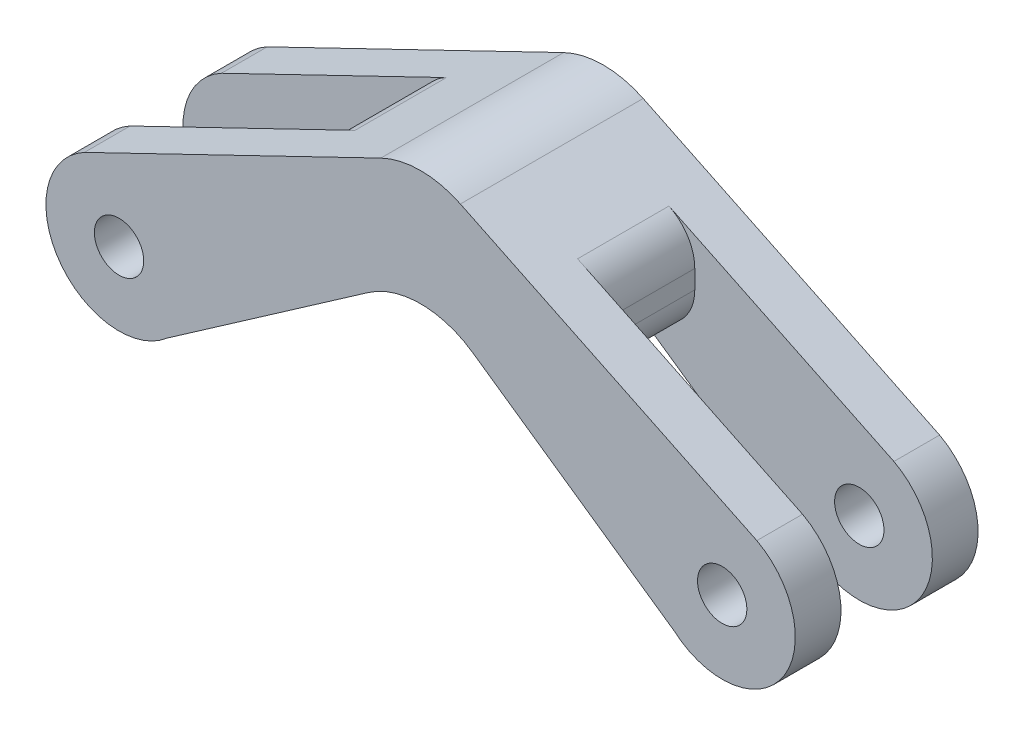
ISO-10303-21;
HEADER;
FILE_DESCRIPTION(('STEP AP214'),'2;1');
FILE_NAME('part.step','',(''),(''),'','','');
FILE_SCHEMA(('AUTOMOTIVE_DESIGN { 1 0 10303 214 1 1 1 1 }'));
ENDSEC;
DATA;
#1=APPLICATION_CONTEXT('core data for automotive mechanical design processes');
#2=APPLICATION_PROTOCOL_DEFINITION('international standard','automotive_design',2000,#1);
#3=PRODUCT_CONTEXT('',#1,'mechanical');
#4=PRODUCT('Part','Part','',(#3));
#5=PRODUCT_RELATED_PRODUCT_CATEGORY('part','',(#4));
#6=PRODUCT_DEFINITION_FORMATION('','',#4);
#7=PRODUCT_DEFINITION_CONTEXT('part definition',#1,'design');
#8=PRODUCT_DEFINITION('design','',#6,#7);
#9=PRODUCT_DEFINITION_SHAPE('','',#8);
#10=(LENGTH_UNIT() NAMED_UNIT(*) SI_UNIT(.MILLI.,.METRE.));
#11=(NAMED_UNIT(*) PLANE_ANGLE_UNIT() SI_UNIT($,.RADIAN.));
#12=(NAMED_UNIT(*) SI_UNIT($,.STERADIAN.) SOLID_ANGLE_UNIT());
#13=UNCERTAINTY_MEASURE_WITH_UNIT(LENGTH_MEASURE(1.E-05),#10,'distance_accuracy_value','');
#14=(GEOMETRIC_REPRESENTATION_CONTEXT(3) GLOBAL_UNCERTAINTY_ASSIGNED_CONTEXT((#13)) GLOBAL_UNIT_ASSIGNED_CONTEXT((#10,
#11,#12)) REPRESENTATION_CONTEXT('',''));
#15=CARTESIAN_POINT('',(0.,0.,0.));
#16=DIRECTION('',(0.,0.,1.));
#17=DIRECTION('',(1.,0.,0.));
#18=AXIS2_PLACEMENT_3D('',#15,#16,#17);
#19=CARTESIAN_POINT('',(0.,0.,0.));
#20=DIRECTION('',(0.,0.,1.));
#21=DIRECTION('',(1.,0.,0.));
#22=AXIS2_PLACEMENT_3D('',#19,#20,#21);
#23=PLANE('',#22);
#24=CARTESIAN_POINT('',(0.,0.,0.));
#25=DIRECTION('',(0.,0.,1.));
#26=DIRECTION('',(1.,0.,0.));
#27=AXIS2_PLACEMENT_3D('',#24,#25,#26);
#28=CIRCLE('',#27,1.7145);
#29=CARTESIAN_POINT('',(1.7145,0.,0.));
#30=VERTEX_POINT('',#29);
#31=EDGE_CURVE('E261',#30,#30,#28,.T.);
#32=ORIENTED_EDGE('',*,*,#31,.T.);
#33=EDGE_LOOP('',(#32));
#34=FACE_BOUND('',#33,.T.);
#35=DIRECTION('',(0.,1.,0.));
#36=VECTOR('',#35,1.);
#37=CARTESIAN_POINT('',(11.43,-21.59,0.));
#38=LINE('',#37,#36);
#39=CARTESIAN_POINT('',(11.43,7.88041539796579,0.));
#40=VERTEX_POINT('',#39);
#41=CARTESIAN_POINT('',(11.43,9.16917968452816,0.));
#42=VERTEX_POINT('',#41);
#43=EDGE_CURVE('E252',#40,#42,#38,.T.);
#44=ORIENTED_EDGE('',*,*,#43,.F.);
#45=CARTESIAN_POINT('',(14.605,7.88041539796579,0.));
#46=DIRECTION('',(0.,0.,1.));
#47=DIRECTION('',(1.,0.,0.));
#48=AXIS2_PLACEMENT_3D('',#45,#46,#47);
#49=CIRCLE('',#48,3.175);
#50=CARTESIAN_POINT('',(16.418933125613,5.27460043603855,0.));
#51=VERTEX_POINT('',#50);
#52=EDGE_CURVE('E43',#40,#51,#49,.T.);
#53=ORIENTED_EDGE('',*,*,#52,.T.);
#54=DIRECTION('',(-0.820729121866846,-0.571317519878111,0.));
#55=VECTOR('',#54,1.);
#56=CARTESIAN_POINT('',(2.88595672970742,-4.14583598455693,0.));
#57=LINE('',#56,#55);
#58=CARTESIAN_POINT('',(3.32770250004454,-3.83833245970139,0.));
#59=VERTEX_POINT('',#58);
#60=EDGE_CURVE('E50',#51,#59,#57,.T.);
#61=ORIENTED_EDGE('',*,*,#60,.T.);
#62=CARTESIAN_POINT('',(0.,0.,0.));
#63=DIRECTION('',(0.,0.,1.));
#64=DIRECTION('',(1.,0.,0.));
#65=AXIS2_PLACEMENT_3D('',#62,#63,#64);
#66=CIRCLE('',#65,5.08);
#67=CARTESIAN_POINT('',(-2.40732534983982,4.47338626322594,0.));
#68=VERTEX_POINT('',#67);
#69=EDGE_CURVE('E294',#68,#59,#66,.T.);
#70=ORIENTED_EDGE('',*,*,#69,.F.);
#71=DIRECTION('',(-0.900358431435915,-0.435149049111058,0.));
#72=VECTOR('',#71,1.);
#73=CARTESIAN_POINT('',(-2.20846687708953,4.56949584836856,0.));
#74=LINE('',#73,#72);
#75=CARTESIAN_POINT('',(13.2234017690724,12.0278177043372,0.));
#76=VERTEX_POINT('',#75);
#77=EDGE_CURVE('E292',#76,#68,#74,.T.);
#78=ORIENTED_EDGE('',*,*,#77,.F.);
#79=CARTESIAN_POINT('',(14.605,9.16917968452816,0.));
#80=DIRECTION('',(0.,0.,1.));
#81=DIRECTION('',(1.,0.,0.));
#82=AXIS2_PLACEMENT_3D('',#79,#80,#81);
#83=CIRCLE('',#82,3.175);
#84=EDGE_CURVE('E336',#76,#42,#83,.T.);
#85=ORIENTED_EDGE('',*,*,#84,.T.);
#86=EDGE_LOOP('',(#44,#53,#61,#70,#78,#85));
#87=FACE_BOUND('',#86,.T.);
#88=ADVANCED_FACE('F35',(#34,#87),#23,.F.);
#89=CARTESIAN_POINT('',(41.91,0.,3.175));
#90=DIRECTION('',(0.,0.,-1.));
#91=DIRECTION('',(-1.,0.,0.));
#92=AXIS2_PLACEMENT_3D('',#89,#90,#91);
#93=CYLINDRICAL_SURFACE('',#92,5.07999999999999);
#94=CARTESIAN_POINT('',(41.91,0.,0.));
#95=DIRECTION('',(0.,0.,1.));
#96=DIRECTION('',(1.,0.,0.));
#97=AXIS2_PLACEMENT_3D('',#94,#95,#96);
#98=CIRCLE('',#97,5.07999999999999);
#99=CARTESIAN_POINT('',(44.3173253498398,4.47338626322595,0.));
#100=VERTEX_POINT('',#99);
#101=CARTESIAN_POINT('',(38.5822974999555,-3.83833245970138,0.));
#102=VERTEX_POINT('',#101);
#103=EDGE_CURVE('E287',#100,#102,#98,.F.);
#104=ORIENTED_EDGE('',*,*,#103,.F.);
#105=DIRECTION('',(0.,0.,-1.));
#106=VECTOR('',#105,1.);
#107=CARTESIAN_POINT('',(44.3173253498398,4.47338626322595,3.175));
#108=LINE('',#107,#106);
#109=CARTESIAN_POINT('',(44.3173253498398,4.47338626322595,3.175));
#110=VERTEX_POINT('',#109);
#111=EDGE_CURVE('E253',#110,#100,#108,.T.);
#112=ORIENTED_EDGE('',*,*,#111,.F.);
#113=CARTESIAN_POINT('',(41.91,0.,3.175));
#114=DIRECTION('',(0.,0.,1.));
#115=DIRECTION('',(1.,0.,0.));
#116=AXIS2_PLACEMENT_3D('',#113,#114,#115);
#117=CIRCLE('',#116,5.07999999999999);
#118=CARTESIAN_POINT('',(38.5822974999555,-3.83833245970138,3.175));
#119=VERTEX_POINT('',#118);
#120=EDGE_CURVE('E260',#110,#119,#117,.F.);
#121=ORIENTED_EDGE('',*,*,#120,.T.);
#122=DIRECTION('',(0.,0.,-1.));
#123=VECTOR('',#122,1.);
#124=CARTESIAN_POINT('',(38.5822974999555,-3.83833245970138,3.175));
#125=LINE('',#124,#123);
#126=EDGE_CURVE('E284',#119,#102,#125,.T.);
#127=ORIENTED_EDGE('',*,*,#126,.T.);
#128=EDGE_LOOP('',(#104,#112,#121,#127));
#129=FACE_BOUND('',#128,.T.);
#130=ADVANCED_FACE('F414',(#129),#93,.T.);
#131=CARTESIAN_POINT('',(10.1443221421196,20.9894195805271,3.175));
#132=DIRECTION('',(0.435149049111058,0.900358431435915,0.));
#133=DIRECTION('',(-0.900358431435915,0.435149049111058,0.));
#134=AXIS2_PLACEMENT_3D('',#131,#132,#133);
#135=PLANE('',#134);
#136=DIRECTION('',(0.,0.,-1.));
#137=VECTOR('',#136,1.);
#138=CARTESIAN_POINT('',(28.6865982309276,12.0278177043372,3.17499999999999));
#139=LINE('',#138,#137);
#140=CARTESIAN_POINT('',(28.6865982309276,12.0278177043372,0.));
#141=VERTEX_POINT('',#140);
#142=CARTESIAN_POINT('',(28.6865982309276,12.0278177043372,-6.35));
#143=VERTEX_POINT('',#142);
#144=EDGE_CURVE('E178',#141,#143,#139,.T.);
#145=ORIENTED_EDGE('',*,*,#144,.T.);
#146=DIRECTION('',(0.900358431435915,-0.435149049111058,0.));
#147=VECTOR('',#146,1.);
#148=CARTESIAN_POINT('',(10.1443221421196,20.9894195805271,-6.35));
#149=LINE('',#148,#147);
#150=CARTESIAN_POINT('',(44.3173253498398,4.47338626322595,-6.35));
#151=VERTEX_POINT('',#150);
#152=EDGE_CURVE('E171',#143,#151,#149,.T.);
#153=ORIENTED_EDGE('',*,*,#152,.T.);
#154=DIRECTION('',(0.,0.,-1.));
#155=VECTOR('',#154,1.);
#156=CARTESIAN_POINT('',(44.3173253498398,4.47338626322595,-6.35));
#157=LINE('',#156,#155);
#158=CARTESIAN_POINT('',(44.3173253498398,4.47338626322595,-9.525));
#159=VERTEX_POINT('',#158);
#160=EDGE_CURVE('E175',#151,#159,#157,.T.);
#161=ORIENTED_EDGE('',*,*,#160,.T.);
#162=DIRECTION('',(0.900358431435915,-0.435149049111058,0.));
#163=VECTOR('',#162,1.);
#164=CARTESIAN_POINT('',(10.1443221421196,20.9894195805271,-9.525));
#165=LINE('',#164,#163);
#166=CARTESIAN_POINT('',(23.7181964618552,14.4290783911123,-9.525));
#167=VERTEX_POINT('',#166);
#168=EDGE_CURVE('E218',#167,#159,#165,.T.);
#169=ORIENTED_EDGE('',*,*,#168,.F.);
#170=DIRECTION('',(0.,0.,-1.));
#171=VECTOR('',#170,1.);
#172=CARTESIAN_POINT('',(23.7181964618552,14.4290783911123,3.175));
#173=LINE('',#172,#171);
#174=CARTESIAN_POINT('',(23.7181964618552,14.4290783911123,3.175));
#175=VERTEX_POINT('',#174);
#176=EDGE_CURVE('E315',#175,#167,#173,.T.);
#177=ORIENTED_EDGE('',*,*,#176,.F.);
#178=DIRECTION('',(0.900358431435915,-0.435149049111058,0.));
#179=VECTOR('',#178,1.);
#180=CARTESIAN_POINT('',(10.1443221421196,20.9894195805271,3.175));
#181=LINE('',#180,#179);
#182=EDGE_CURVE('E264',#175,#110,#181,.T.);
#183=ORIENTED_EDGE('',*,*,#182,.T.);
#184=ORIENTED_EDGE('',*,*,#111,.T.);
#185=DIRECTION('',(0.900358431435915,-0.435149049111058,0.));
#186=VECTOR('',#185,1.);
#187=CARTESIAN_POINT('',(10.1443221421196,20.9894195805271,0.));
#188=LINE('',#187,#186);
#189=EDGE_CURVE('E290',#141,#100,#188,.T.);
#190=ORIENTED_EDGE('',*,*,#189,.F.);
#191=EDGE_LOOP('',(#145,#153,#161,#169,#177,#183,#184,#190));
#192=FACE_BOUND('',#191,.T.);
#193=ADVANCED_FACE('F173',(#192),#135,.T.);
#194=CARTESIAN_POINT('',(20.955,8.71180235149422,3.175));
#195=DIRECTION('',(0.,0.,-1.));
#196=DIRECTION('',(-1.,0.,0.));
#197=AXIS2_PLACEMENT_3D('',#194,#195,#196);
#198=CYLINDRICAL_SURFACE('',#197,6.35);
#199=ORIENTED_EDGE('',*,*,#176,.T.);
#200=CARTESIAN_POINT('',(20.955,8.71180235149422,-9.525));
#201=DIRECTION('',(0.,0.,1.));
#202=DIRECTION('',(1.,0.,0.));
#203=AXIS2_PLACEMENT_3D('',#200,#201,#202);
#204=CIRCLE('',#203,6.35);
#205=CARTESIAN_POINT('',(18.1918035381448,14.4290783911123,-9.525));
#206=VERTEX_POINT('',#205);
#207=EDGE_CURVE('E220',#206,#167,#204,.F.);
#208=ORIENTED_EDGE('',*,*,#207,.F.);
#209=DIRECTION('',(0.,0.,-1.));
#210=VECTOR('',#209,1.);
#211=CARTESIAN_POINT('',(18.1918035381448,14.4290783911123,3.175));
#212=LINE('',#211,#210);
#213=CARTESIAN_POINT('',(18.1918035381448,14.4290783911123,3.175));
#214=VERTEX_POINT('',#213);
#215=EDGE_CURVE('E313',#214,#206,#212,.T.);
#216=ORIENTED_EDGE('',*,*,#215,.F.);
#217=CARTESIAN_POINT('',(20.955,8.71180235149422,3.175));
#218=DIRECTION('',(0.,0.,1.));
#219=DIRECTION('',(1.,0.,0.));
#220=AXIS2_PLACEMENT_3D('',#217,#218,#219);
#221=CIRCLE('',#220,6.35);
#222=EDGE_CURVE('E266',#214,#175,#221,.F.);
#223=ORIENTED_EDGE('',*,*,#222,.T.);
#224=EDGE_LOOP('',(#199,#208,#216,#223));
#225=FACE_BOUND('',#224,.T.);
#226=ADVANCED_FACE('F441',(#225),#198,.T.);
#227=CARTESIAN_POINT('',(-2.20846687708953,4.56949584836856,3.175));
#228=DIRECTION('',(0.435149049111058,-0.900358431435915,0.));
#229=DIRECTION('',(0.900358431435915,0.435149049111058,0.));
#230=AXIS2_PLACEMENT_3D('',#227,#228,#229);
#231=PLANE('',#230);
#232=DIRECTION('',(0.,0.,1.));
#233=VECTOR('',#232,1.);
#234=CARTESIAN_POINT('',(13.2234017690724,12.0278177043372,0.));
#235=LINE('',#234,#233);
#236=CARTESIAN_POINT('',(13.2234017690724,12.0278177043372,-6.35));
#237=VERTEX_POINT('',#236);
#238=EDGE_CURVE('E256',#237,#76,#235,.T.);
#239=ORIENTED_EDGE('',*,*,#238,.T.);
#240=ORIENTED_EDGE('',*,*,#77,.T.);
#241=DIRECTION('',(0.,0.,-1.));
#242=VECTOR('',#241,1.);
#243=CARTESIAN_POINT('',(-2.40732534983982,4.47338626322594,3.175));
#244=LINE('',#243,#242);
#245=CARTESIAN_POINT('',(-2.40732534983982,4.47338626322594,3.175));
#246=VERTEX_POINT('',#245);
#247=EDGE_CURVE('E310',#246,#68,#244,.T.);
#248=ORIENTED_EDGE('',*,*,#247,.F.);
#249=DIRECTION('',(-0.900358431435915,-0.435149049111058,0.));
#250=VECTOR('',#249,1.);
#251=CARTESIAN_POINT('',(-2.20846687708953,4.56949584836856,3.175));
#252=LINE('',#251,#250);
#253=EDGE_CURVE('E269',#214,#246,#252,.T.);
#254=ORIENTED_EDGE('',*,*,#253,.F.);
#255=ORIENTED_EDGE('',*,*,#215,.T.);
#256=DIRECTION('',(-0.900358431435915,-0.435149049111058,0.));
#257=VECTOR('',#256,1.);
#258=CARTESIAN_POINT('',(-2.20846687708953,4.56949584836856,-9.525));
#259=LINE('',#258,#257);
#260=CARTESIAN_POINT('',(-2.40732534983982,4.47338626322594,-9.525));
#261=VERTEX_POINT('',#260);
#262=EDGE_CURVE('E223',#206,#261,#259,.T.);
#263=ORIENTED_EDGE('',*,*,#262,.T.);
#264=DIRECTION('',(0.,0.,-1.));
#265=VECTOR('',#264,1.);
#266=CARTESIAN_POINT('',(-2.40732534983982,4.47338626322594,-6.35));
#267=LINE('',#266,#265);
#268=CARTESIAN_POINT('',(-2.40732534983982,4.47338626322594,-6.35));
#269=VERTEX_POINT('',#268);
#270=EDGE_CURVE('E192',#269,#261,#267,.T.);
#271=ORIENTED_EDGE('',*,*,#270,.F.);
#272=DIRECTION('',(-0.900358431435915,-0.435149049111058,0.));
#273=VECTOR('',#272,1.);
#274=CARTESIAN_POINT('',(-2.20846687708953,4.56949584836856,-6.35));
#275=LINE('',#274,#273);
#276=EDGE_CURVE('E182',#237,#269,#275,.T.);
#277=ORIENTED_EDGE('',*,*,#276,.F.);
#278=EDGE_LOOP('',(#239,#240,#248,#254,#255,#263,#271,#277));
#279=FACE_BOUND('',#278,.T.);
#280=ADVANCED_FACE('F396',(#279),#231,.F.);
#281=CARTESIAN_POINT('',(0.,0.,3.175));
#282=DIRECTION('',(0.,0.,-1.));
#283=DIRECTION('',(-1.,0.,0.));
#284=AXIS2_PLACEMENT_3D('',#281,#282,#283);
#285=CYLINDRICAL_SURFACE('',#284,5.08);
#286=ORIENTED_EDGE('',*,*,#69,.T.);
#287=DIRECTION('',(0.,0.,-1.));
#288=VECTOR('',#287,1.);
#289=CARTESIAN_POINT('',(3.32770250004454,-3.83833245970139,3.175));
#290=LINE('',#289,#288);
#291=CARTESIAN_POINT('',(3.32770250004454,-3.83833245970139,3.175));
#292=VERTEX_POINT('',#291);
#293=EDGE_CURVE('E308',#292,#59,#290,.T.);
#294=ORIENTED_EDGE('',*,*,#293,.F.);
#295=CARTESIAN_POINT('',(0.,0.,3.175));
#296=DIRECTION('',(0.,0.,1.));
#297=DIRECTION('',(1.,0.,0.));
#298=AXIS2_PLACEMENT_3D('',#295,#296,#297);
#299=CIRCLE('',#298,5.08);
#300=EDGE_CURVE('E271',#246,#292,#299,.T.);
#301=ORIENTED_EDGE('',*,*,#300,.F.);
#302=ORIENTED_EDGE('',*,*,#247,.T.);
#303=EDGE_LOOP('',(#286,#294,#301,#302));
#304=FACE_BOUND('',#303,.T.);
#305=ADVANCED_FACE('F388',(#304),#285,.T.);
#306=CARTESIAN_POINT('',(2.88595672970742,-4.14583598455693,3.175));
#307=DIRECTION('',(0.571317519878111,-0.820729121866846,0.));
#308=DIRECTION('',(0.820729121866846,0.571317519878111,0.));
#309=AXIS2_PLACEMENT_3D('',#306,#307,#308);
#310=PLANE('',#309);
#311=ORIENTED_EDGE('',*,*,#60,.F.);
#312=DIRECTION('',(0.,0.,1.));
#313=VECTOR('',#312,1.);
#314=CARTESIAN_POINT('',(16.418933125613,5.27460043603856,3.175));
#315=LINE('',#314,#313);
#316=CARTESIAN_POINT('',(16.418933125613,5.27460043603856,-6.35));
#317=VERTEX_POINT('',#316);
#318=EDGE_CURVE('E334',#51,#317,#315,.F.);
#319=ORIENTED_EDGE('',*,*,#318,.T.);
#320=DIRECTION('',(-0.820729121866846,-0.571317519878111,0.));
#321=VECTOR('',#320,1.);
#322=CARTESIAN_POINT('',(2.88595672970742,-4.14583598455693,-6.35));
#323=LINE('',#322,#321);
#324=CARTESIAN_POINT('',(3.32770250004454,-3.83833245970139,-6.35));
#325=VERTEX_POINT('',#324);
#326=EDGE_CURVE('E57',#317,#325,#323,.T.);
#327=ORIENTED_EDGE('',*,*,#326,.T.);
#328=DIRECTION('',(0.,0.,-1.));
#329=VECTOR('',#328,1.);
#330=CARTESIAN_POINT('',(3.32770250004454,-3.83833245970139,-6.35));
#331=LINE('',#330,#329);
#332=CARTESIAN_POINT('',(3.32770250004454,-3.83833245970139,-9.525));
#333=VERTEX_POINT('',#332);
#334=EDGE_CURVE('E238',#325,#333,#331,.T.);
#335=ORIENTED_EDGE('',*,*,#334,.T.);
#336=DIRECTION('',(-0.820729121866846,-0.571317519878111,0.));
#337=VECTOR('',#336,1.);
#338=CARTESIAN_POINT('',(2.88595672970742,-4.14583598455693,-9.525));
#339=LINE('',#338,#337);
#340=CARTESIAN_POINT('',(17.327133748774,5.90680771826079,-9.525));
#341=VERTEX_POINT('',#340);
#342=EDGE_CURVE('E228',#341,#333,#339,.T.);
#343=ORIENTED_EDGE('',*,*,#342,.F.);
#344=DIRECTION('',(0.,0.,-1.));
#345=VECTOR('',#344,1.);
#346=CARTESIAN_POINT('',(17.327133748774,5.90680771826079,3.175));
#347=LINE('',#346,#345);
#348=CARTESIAN_POINT('',(17.327133748774,5.90680771826079,3.175));
#349=VERTEX_POINT('',#348);
#350=EDGE_CURVE('E306',#349,#341,#347,.T.);
#351=ORIENTED_EDGE('',*,*,#350,.F.);
#352=DIRECTION('',(-0.820729121866846,-0.571317519878111,0.));
#353=VECTOR('',#352,1.);
#354=CARTESIAN_POINT('',(2.88595672970742,-4.14583598455693,3.175));
#355=LINE('',#354,#353);
#356=EDGE_CURVE('E274',#349,#292,#355,.T.);
#357=ORIENTED_EDGE('',*,*,#356,.T.);
#358=ORIENTED_EDGE('',*,*,#293,.T.);
#359=EDGE_LOOP('',(#311,#319,#327,#335,#343,#351,#357,#358));
#360=FACE_BOUND('',#359,.T.);
#361=ADVANCED_FACE('F356',(#360),#310,.T.);
#362=CARTESIAN_POINT('',(20.955,0.695177794406331,3.175));
#363=DIRECTION('',(0.,0.,-1.));
#364=DIRECTION('',(-1.,0.,0.));
#365=AXIS2_PLACEMENT_3D('',#362,#363,#364);
#366=CYLINDRICAL_SURFACE('',#365,6.35);
#367=ORIENTED_EDGE('',*,*,#350,.T.);
#368=CARTESIAN_POINT('',(20.955,0.695177794406331,-9.525));
#369=DIRECTION('',(0.,0.,1.));
#370=DIRECTION('',(1.,0.,0.));
#371=AXIS2_PLACEMENT_3D('',#368,#369,#370);
#372=CIRCLE('',#371,6.35);
#373=CARTESIAN_POINT('',(24.582866251226,5.90680771826079,-9.525));
#374=VERTEX_POINT('',#373);
#375=EDGE_CURVE('E230',#341,#374,#372,.F.);
#376=ORIENTED_EDGE('',*,*,#375,.T.);
#377=DIRECTION('',(0.,0.,-1.));
#378=VECTOR('',#377,1.);
#379=CARTESIAN_POINT('',(24.582866251226,5.90680771826079,3.175));
#380=LINE('',#379,#378);
#381=CARTESIAN_POINT('',(24.582866251226,5.90680771826079,3.175));
#382=VERTEX_POINT('',#381);
#383=EDGE_CURVE('E304',#382,#374,#380,.T.);
#384=ORIENTED_EDGE('',*,*,#383,.F.);
#385=CARTESIAN_POINT('',(20.955,0.695177794406331,3.175));
#386=DIRECTION('',(0.,0.,1.));
#387=DIRECTION('',(1.,0.,0.));
#388=AXIS2_PLACEMENT_3D('',#385,#386,#387);
#389=CIRCLE('',#388,6.35);
#390=EDGE_CURVE('E276',#349,#382,#389,.F.);
#391=ORIENTED_EDGE('',*,*,#390,.F.);
#392=EDGE_LOOP('',(#367,#376,#384,#391));
#393=FACE_BOUND('',#392,.T.);
#394=ADVANCED_FACE('F377',(#393),#366,.F.);
#395=CARTESIAN_POINT('',(10.7936226943522,15.505634200729,3.175));
#396=DIRECTION('',(0.57131751987811,0.820729121866847,0.));
#397=DIRECTION('',(-0.820729121866847,0.57131751987811,0.));
#398=AXIS2_PLACEMENT_3D('',#395,#396,#397);
#399=PLANE('',#398);
#400=DIRECTION('',(0.,0.,1.));
#401=VECTOR('',#400,1.);
#402=CARTESIAN_POINT('',(25.491066874387,5.27460043603855,0.));
#403=LINE('',#402,#401);
#404=CARTESIAN_POINT('',(25.491066874387,5.27460043603855,-6.35));
#405=VERTEX_POINT('',#404);
#406=CARTESIAN_POINT('',(25.491066874387,5.27460043603855,0.));
#407=VERTEX_POINT('',#406);
#408=EDGE_CURVE('E331',#405,#407,#403,.T.);
#409=ORIENTED_EDGE('',*,*,#408,.T.);
#410=DIRECTION('',(0.820729121866847,-0.57131751987811,0.));
#411=VECTOR('',#410,1.);
#412=CARTESIAN_POINT('',(10.7936226943522,15.505634200729,0.));
#413=LINE('',#412,#411);
#414=EDGE_CURVE('E298',#407,#102,#413,.T.);
#415=ORIENTED_EDGE('',*,*,#414,.T.);
#416=ORIENTED_EDGE('',*,*,#126,.F.);
#417=DIRECTION('',(0.820729121866847,-0.57131751987811,0.));
#418=VECTOR('',#417,1.);
#419=CARTESIAN_POINT('',(10.7936226943522,15.505634200729,3.175));
#420=LINE('',#419,#418);
#421=EDGE_CURVE('E279',#382,#119,#420,.T.);
#422=ORIENTED_EDGE('',*,*,#421,.F.);
#423=ORIENTED_EDGE('',*,*,#383,.T.);
#424=DIRECTION('',(0.820729121866847,-0.57131751987811,0.));
#425=VECTOR('',#424,1.);
#426=CARTESIAN_POINT('',(10.7936226943522,15.505634200729,-9.525));
#427=LINE('',#426,#425);
#428=CARTESIAN_POINT('',(38.5822974999555,-3.83833245970138,-9.525));
#429=VERTEX_POINT('',#428);
#430=EDGE_CURVE('E233',#374,#429,#427,.T.);
#431=ORIENTED_EDGE('',*,*,#430,.T.);
#432=DIRECTION('',(0.,0.,-1.));
#433=VECTOR('',#432,1.);
#434=CARTESIAN_POINT('',(38.5822974999555,-3.83833245970138,-6.35));
#435=LINE('',#434,#433);
#436=CARTESIAN_POINT('',(38.5822974999555,-3.83833245970138,-6.35));
#437=VERTEX_POINT('',#436);
#438=EDGE_CURVE('E213',#437,#429,#435,.T.);
#439=ORIENTED_EDGE('',*,*,#438,.F.);
#440=DIRECTION('',(0.820729121866847,-0.57131751987811,0.));
#441=VECTOR('',#440,1.);
#442=CARTESIAN_POINT('',(10.7936226943522,15.505634200729,-6.35));
#443=LINE('',#442,#441);
#444=EDGE_CURVE('E197',#405,#437,#443,.T.);
#445=ORIENTED_EDGE('',*,*,#444,.F.);
#446=EDGE_LOOP('',(#409,#415,#416,#422,#423,#431,#439,#445));
#447=FACE_BOUND('',#446,.T.);
#448=ADVANCED_FACE('F429',(#447),#399,.F.);
#449=CARTESIAN_POINT('',(41.91,0.,3.175));
#450=DIRECTION('',(0.,0.,-1.));
#451=DIRECTION('',(-1.,0.,0.));
#452=AXIS2_PLACEMENT_3D('',#449,#450,#451);
#453=CYLINDRICAL_SURFACE('',#452,1.7145);
#454=CARTESIAN_POINT('',(41.91,0.,3.175));
#455=DIRECTION('',(0.,0.,1.));
#456=DIRECTION('',(1.,0.,0.));
#457=AXIS2_PLACEMENT_3D('',#454,#455,#456);
#458=CIRCLE('',#457,1.7145);
#459=CARTESIAN_POINT('',(43.6245,0.,3.175));
#460=VERTEX_POINT('',#459);
#461=EDGE_CURVE('E257',#460,#460,#458,.T.);
#462=ORIENTED_EDGE('',*,*,#461,.T.);
#463=EDGE_LOOP('',(#462));
#464=FACE_BOUND('',#463,.T.);
#465=CARTESIAN_POINT('',(41.91,0.,0.));
#466=DIRECTION('',(0.,0.,1.));
#467=DIRECTION('',(1.,0.,0.));
#468=AXIS2_PLACEMENT_3D('',#465,#466,#467);
#469=CIRCLE('',#468,1.7145);
#470=CARTESIAN_POINT('',(43.6245,0.,0.));
#471=VERTEX_POINT('',#470);
#472=EDGE_CURVE('E246',#471,#471,#469,.T.);
#473=ORIENTED_EDGE('',*,*,#472,.F.);
#474=EDGE_LOOP('',(#473));
#475=FACE_BOUND('',#474,.T.);
#476=ADVANCED_FACE('F427',(#464,#475),#453,.F.);
#477=CARTESIAN_POINT('',(0.,0.,3.175));
#478=DIRECTION('',(0.,0.,-1.));
#479=DIRECTION('',(-1.,0.,0.));
#480=AXIS2_PLACEMENT_3D('',#477,#478,#479);
#481=CYLINDRICAL_SURFACE('',#480,1.7145);
#482=CARTESIAN_POINT('',(0.,0.,3.175));
#483=DIRECTION('',(0.,0.,1.));
#484=DIRECTION('',(1.,0.,0.));
#485=AXIS2_PLACEMENT_3D('',#482,#483,#484);
#486=CIRCLE('',#485,1.7145);
#487=CARTESIAN_POINT('',(1.7145,0.,3.175));
#488=VERTEX_POINT('',#487);
#489=EDGE_CURVE('E281',#488,#488,#486,.T.);
#490=ORIENTED_EDGE('',*,*,#489,.T.);
#491=EDGE_LOOP('',(#490));
#492=FACE_BOUND('',#491,.T.);
#493=ORIENTED_EDGE('',*,*,#31,.F.);
#494=EDGE_LOOP('',(#493));
#495=FACE_BOUND('',#494,.T.);
#496=ADVANCED_FACE('F424',(#492,#495),#481,.F.);
#497=CARTESIAN_POINT('',(0.,0.,3.175));
#498=DIRECTION('',(0.,0.,1.));
#499=DIRECTION('',(1.,0.,0.));
#500=AXIS2_PLACEMENT_3D('',#497,#498,#499);
#501=PLANE('',#500);
#502=ORIENTED_EDGE('',*,*,#461,.F.);
#503=EDGE_LOOP('',(#502));
#504=FACE_BOUND('',#503,.T.);
#505=ORIENTED_EDGE('',*,*,#120,.F.);
#506=ORIENTED_EDGE('',*,*,#182,.F.);
#507=ORIENTED_EDGE('',*,*,#222,.F.);
#508=ORIENTED_EDGE('',*,*,#253,.T.);
#509=ORIENTED_EDGE('',*,*,#300,.T.);
#510=ORIENTED_EDGE('',*,*,#356,.F.);
#511=ORIENTED_EDGE('',*,*,#390,.T.);
#512=ORIENTED_EDGE('',*,*,#421,.T.);
#513=EDGE_LOOP('',(#505,#506,#507,#508,#509,#510,#511,#512));
#514=FACE_BOUND('',#513,.T.);
#515=ORIENTED_EDGE('',*,*,#489,.F.);
#516=EDGE_LOOP('',(#515));
#517=FACE_BOUND('',#516,.T.);
#518=ADVANCED_FACE('F380',(#504,#514,#517),#501,.T.);
#519=ORIENTED_EDGE('',*,*,#472,.T.);
#520=EDGE_LOOP('',(#519));
#521=FACE_BOUND('',#520,.T.);
#522=ORIENTED_EDGE('',*,*,#414,.F.);
#523=CARTESIAN_POINT('',(27.305,7.88041539796579,0.));
#524=DIRECTION('',(0.,0.,1.));
#525=DIRECTION('',(1.,0.,0.));
#526=AXIS2_PLACEMENT_3D('',#523,#524,#525);
#527=CIRCLE('',#526,3.175);
#528=CARTESIAN_POINT('',(30.48,7.88041539796579,0.));
#529=VERTEX_POINT('',#528);
#530=EDGE_CURVE('E346',#407,#529,#527,.T.);
#531=ORIENTED_EDGE('',*,*,#530,.T.);
#532=DIRECTION('',(0.,1.,0.));
#533=VECTOR('',#532,1.);
#534=CARTESIAN_POINT('',(30.48,-21.59,0.));
#535=LINE('',#534,#533);
#536=CARTESIAN_POINT('',(30.48,9.16917968452816,0.));
#537=VERTEX_POINT('',#536);
#538=EDGE_CURVE('E249',#529,#537,#535,.T.);
#539=ORIENTED_EDGE('',*,*,#538,.T.);
#540=CARTESIAN_POINT('',(27.305,9.16917968452816,0.));
#541=DIRECTION('',(0.,0.,1.));
#542=DIRECTION('',(1.,0.,0.));
#543=AXIS2_PLACEMENT_3D('',#540,#541,#542);
#544=CIRCLE('',#543,3.175);
#545=EDGE_CURVE('E343',#537,#141,#544,.T.);
#546=ORIENTED_EDGE('',*,*,#545,.T.);
#547=ORIENTED_EDGE('',*,*,#189,.T.);
#548=ORIENTED_EDGE('',*,*,#103,.T.);
#549=EDGE_LOOP('',(#522,#531,#539,#546,#547,#548));
#550=FACE_BOUND('',#549,.T.);
#551=ADVANCED_FACE('F402',(#521,#550),#23,.F.);
#552=CARTESIAN_POINT('',(11.43,-21.59,0.));
#553=DIRECTION('',(-1.,0.,0.));
#554=DIRECTION('',(0.,0.,1.));
#555=AXIS2_PLACEMENT_3D('',#552,#553,#554);
#556=PLANE('',#555);
#557=ORIENTED_EDGE('',*,*,#43,.T.);
#558=DIRECTION('',(0.,0.,1.));
#559=VECTOR('',#558,1.);
#560=CARTESIAN_POINT('',(11.43,9.16917968452816,-6.35));
#561=LINE('',#560,#559);
#562=CARTESIAN_POINT('',(11.43,9.16917968452816,-6.35));
#563=VERTEX_POINT('',#562);
#564=EDGE_CURVE('E324',#42,#563,#561,.F.);
#565=ORIENTED_EDGE('',*,*,#564,.T.);
#566=DIRECTION('',(0.,1.,0.));
#567=VECTOR('',#566,1.);
#568=CARTESIAN_POINT('',(11.43,-21.59,-6.35));
#569=LINE('',#568,#567);
#570=CARTESIAN_POINT('',(11.43,7.88041539796579,-6.35));
#571=VERTEX_POINT('',#570);
#572=EDGE_CURVE('E243',#571,#563,#569,.T.);
#573=ORIENTED_EDGE('',*,*,#572,.F.);
#574=DIRECTION('',(0.,0.,1.));
#575=VECTOR('',#574,1.);
#576=CARTESIAN_POINT('',(11.43,7.88041539796579,0.));
#577=LINE('',#576,#575);
#578=EDGE_CURVE('E321',#571,#40,#577,.T.);
#579=ORIENTED_EDGE('',*,*,#578,.T.);
#580=EDGE_LOOP('',(#557,#565,#573,#579));
#581=FACE_BOUND('',#580,.T.);
#582=ADVANCED_FACE('F399',(#581),#556,.T.);
#583=CARTESIAN_POINT('',(30.48,-21.59,0.));
#584=DIRECTION('',(1.,0.,0.));
#585=DIRECTION('',(0.,0.,-1.));
#586=AXIS2_PLACEMENT_3D('',#583,#584,#585);
#587=PLANE('',#586);
#588=DIRECTION('',(0.,1.,0.));
#589=VECTOR('',#588,1.);
#590=CARTESIAN_POINT('',(30.48,-21.59,-6.35));
#591=LINE('',#590,#589);
#592=CARTESIAN_POINT('',(30.48,7.88041539796579,-6.35));
#593=VERTEX_POINT('',#592);
#594=CARTESIAN_POINT('',(30.48,9.16917968452816,-6.35));
#595=VERTEX_POINT('',#594);
#596=EDGE_CURVE('E191',#593,#595,#591,.T.);
#597=ORIENTED_EDGE('',*,*,#596,.T.);
#598=DIRECTION('',(0.,0.,-1.));
#599=VECTOR('',#598,1.);
#600=CARTESIAN_POINT('',(30.48,9.16917968452816,0.));
#601=LINE('',#600,#599);
#602=EDGE_CURVE('E329',#595,#537,#601,.F.);
#603=ORIENTED_EDGE('',*,*,#602,.T.);
#604=ORIENTED_EDGE('',*,*,#538,.F.);
#605=DIRECTION('',(0.,0.,1.));
#606=VECTOR('',#605,1.);
#607=CARTESIAN_POINT('',(30.48,7.88041539796579,-6.35));
#608=LINE('',#607,#606);
#609=EDGE_CURVE('E327',#529,#593,#608,.F.);
#610=ORIENTED_EDGE('',*,*,#609,.T.);
#611=EDGE_LOOP('',(#597,#603,#604,#610));
#612=FACE_BOUND('',#611,.T.);
#613=ADVANCED_FACE('F401',(#612),#587,.T.);
#614=CARTESIAN_POINT('',(0.,0.,-6.35));
#615=DIRECTION('',(0.,0.,1.));
#616=DIRECTION('',(1.,0.,0.));
#617=AXIS2_PLACEMENT_3D('',#614,#615,#616);
#618=PLANE('',#617);
#619=CARTESIAN_POINT('',(41.91,0.,-6.35));
#620=DIRECTION('',(0.,0.,1.));
#621=DIRECTION('',(1.,0.,0.));
#622=AXIS2_PLACEMENT_3D('',#619,#620,#621);
#623=CIRCLE('',#622,1.7145);
#624=CARTESIAN_POINT('',(43.6245,0.,-6.35));
#625=VERTEX_POINT('',#624);
#626=EDGE_CURVE('E199',#625,#625,#623,.T.);
#627=ORIENTED_EDGE('',*,*,#626,.F.);
#628=EDGE_LOOP('',(#627));
#629=FACE_BOUND('',#628,.T.);
#630=ORIENTED_EDGE('',*,*,#596,.F.);
#631=CARTESIAN_POINT('',(27.305,7.88041539796579,-6.35));
#632=DIRECTION('',(0.,0.,1.));
#633=DIRECTION('',(1.,0.,0.));
#634=AXIS2_PLACEMENT_3D('',#631,#632,#633);
#635=CIRCLE('',#634,3.175);
#636=EDGE_CURVE('E348',#593,#405,#635,.F.);
#637=ORIENTED_EDGE('',*,*,#636,.T.);
#638=ORIENTED_EDGE('',*,*,#444,.T.);
#639=CARTESIAN_POINT('',(41.91,0.,-6.35));
#640=DIRECTION('',(0.,0.,1.));
#641=DIRECTION('',(1.,0.,0.));
#642=AXIS2_PLACEMENT_3D('',#639,#640,#641);
#643=CIRCLE('',#642,5.07999999999999);
#644=EDGE_CURVE('E183',#151,#437,#643,.F.);
#645=ORIENTED_EDGE('',*,*,#644,.F.);
#646=ORIENTED_EDGE('',*,*,#152,.F.);
#647=CARTESIAN_POINT('',(27.305,9.16917968452816,-6.35));
#648=DIRECTION('',(0.,0.,1.));
#649=DIRECTION('',(1.,0.,0.));
#650=AXIS2_PLACEMENT_3D('',#647,#648,#649);
#651=CIRCLE('',#650,3.175);
#652=EDGE_CURVE('E341',#143,#595,#651,.F.);
#653=ORIENTED_EDGE('',*,*,#652,.T.);
#654=EDGE_LOOP('',(#630,#637,#638,#645,#646,#653));
#655=FACE_BOUND('',#654,.T.);
#656=ADVANCED_FACE('F195',(#629,#655),#618,.T.);
#657=CARTESIAN_POINT('',(41.91,0.,-6.35));
#658=DIRECTION('',(0.,0.,-1.));
#659=DIRECTION('',(-1.,0.,0.));
#660=AXIS2_PLACEMENT_3D('',#657,#658,#659);
#661=CYLINDRICAL_SURFACE('',#660,5.07999999999999);
#662=CARTESIAN_POINT('',(41.91,0.,-9.525));
#663=DIRECTION('',(0.,0.,1.));
#664=DIRECTION('',(1.,0.,0.));
#665=AXIS2_PLACEMENT_3D('',#662,#663,#664);
#666=CIRCLE('',#665,5.07999999999999);
#667=EDGE_CURVE('E190',#159,#429,#666,.F.);
#668=ORIENTED_EDGE('',*,*,#667,.F.);
#669=ORIENTED_EDGE('',*,*,#160,.F.);
#670=ORIENTED_EDGE('',*,*,#644,.T.);
#671=ORIENTED_EDGE('',*,*,#438,.T.);
#672=EDGE_LOOP('',(#668,#669,#670,#671));
#673=FACE_BOUND('',#672,.T.);
#674=ADVANCED_FACE('F187',(#673),#661,.T.);
#675=CARTESIAN_POINT('',(0.,0.,-6.35));
#676=DIRECTION('',(0.,0.,-1.));
#677=DIRECTION('',(-1.,0.,0.));
#678=AXIS2_PLACEMENT_3D('',#675,#676,#677);
#679=CYLINDRICAL_SURFACE('',#678,5.08);
#680=CARTESIAN_POINT('',(0.,0.,-9.525));
#681=DIRECTION('',(0.,0.,1.));
#682=DIRECTION('',(1.,0.,0.));
#683=AXIS2_PLACEMENT_3D('',#680,#681,#682);
#684=CIRCLE('',#683,5.08);
#685=EDGE_CURVE('E225',#261,#333,#684,.T.);
#686=ORIENTED_EDGE('',*,*,#685,.T.);
#687=ORIENTED_EDGE('',*,*,#334,.F.);
#688=CARTESIAN_POINT('',(0.,0.,-6.35));
#689=DIRECTION('',(0.,0.,1.));
#690=DIRECTION('',(1.,0.,0.));
#691=AXIS2_PLACEMENT_3D('',#688,#689,#690);
#692=CIRCLE('',#691,5.08);
#693=EDGE_CURVE('E206',#269,#325,#692,.T.);
#694=ORIENTED_EDGE('',*,*,#693,.F.);
#695=ORIENTED_EDGE('',*,*,#270,.T.);
#696=EDGE_LOOP('',(#686,#687,#694,#695));
#697=FACE_BOUND('',#696,.T.);
#698=ADVANCED_FACE('F364',(#697),#679,.T.);
#699=CARTESIAN_POINT('',(41.91,0.,-6.35));
#700=DIRECTION('',(0.,0.,-1.));
#701=DIRECTION('',(-1.,0.,0.));
#702=AXIS2_PLACEMENT_3D('',#699,#700,#701);
#703=CYLINDRICAL_SURFACE('',#702,1.7145);
#704=ORIENTED_EDGE('',*,*,#626,.T.);
#705=EDGE_LOOP('',(#704));
#706=FACE_BOUND('',#705,.T.);
#707=CARTESIAN_POINT('',(41.91,0.,-9.525));
#708=DIRECTION('',(0.,0.,1.));
#709=DIRECTION('',(1.,0.,0.));
#710=AXIS2_PLACEMENT_3D('',#707,#708,#709);
#711=CIRCLE('',#710,1.7145);
#712=CARTESIAN_POINT('',(43.6245,0.,-9.525));
#713=VERTEX_POINT('',#712);
#714=EDGE_CURVE('E214',#713,#713,#711,.T.);
#715=ORIENTED_EDGE('',*,*,#714,.F.);
#716=EDGE_LOOP('',(#715));
#717=FACE_BOUND('',#716,.T.);
#718=ADVANCED_FACE('F678',(#706,#717),#703,.F.);
#719=CARTESIAN_POINT('',(0.,0.,-6.35));
#720=DIRECTION('',(0.,0.,-1.));
#721=DIRECTION('',(-1.,0.,0.));
#722=AXIS2_PLACEMENT_3D('',#719,#720,#721);
#723=CYLINDRICAL_SURFACE('',#722,1.7145);
#724=CARTESIAN_POINT('',(0.,0.,-6.35));
#725=DIRECTION('',(0.,0.,1.));
#726=DIRECTION('',(1.,0.,0.));
#727=AXIS2_PLACEMENT_3D('',#724,#725,#726);
#728=CIRCLE('',#727,1.7145);
#729=CARTESIAN_POINT('',(1.7145,0.,-6.35));
#730=VERTEX_POINT('',#729);
#731=EDGE_CURVE('E210',#730,#730,#728,.T.);
#732=ORIENTED_EDGE('',*,*,#731,.T.);
#733=EDGE_LOOP('',(#732));
#734=FACE_BOUND('',#733,.T.);
#735=CARTESIAN_POINT('',(0.,0.,-9.525));
#736=DIRECTION('',(0.,0.,1.));
#737=DIRECTION('',(1.,0.,0.));
#738=AXIS2_PLACEMENT_3D('',#735,#736,#737);
#739=CIRCLE('',#738,1.7145);
#740=CARTESIAN_POINT('',(1.7145,0.,-9.525));
#741=VERTEX_POINT('',#740);
#742=EDGE_CURVE('E202',#741,#741,#739,.T.);
#743=ORIENTED_EDGE('',*,*,#742,.F.);
#744=EDGE_LOOP('',(#743));
#745=FACE_BOUND('',#744,.T.);
#746=ADVANCED_FACE('F500',(#734,#745),#723,.F.);
#747=ORIENTED_EDGE('',*,*,#326,.F.);
#748=CARTESIAN_POINT('',(14.605,7.88041539796579,-6.35));
#749=DIRECTION('',(0.,0.,1.));
#750=DIRECTION('',(1.,0.,0.));
#751=AXIS2_PLACEMENT_3D('',#748,#749,#750);
#752=CIRCLE('',#751,3.175);
#753=EDGE_CURVE('E11',#317,#571,#752,.F.);
#754=ORIENTED_EDGE('',*,*,#753,.T.);
#755=ORIENTED_EDGE('',*,*,#572,.T.);
#756=CARTESIAN_POINT('',(14.605,9.16917968452816,-6.35));
#757=DIRECTION('',(0.,0.,1.));
#758=DIRECTION('',(1.,0.,0.));
#759=AXIS2_PLACEMENT_3D('',#756,#757,#758);
#760=CIRCLE('',#759,3.175);
#761=EDGE_CURVE('E338',#563,#237,#760,.F.);
#762=ORIENTED_EDGE('',*,*,#761,.T.);
#763=ORIENTED_EDGE('',*,*,#276,.T.);
#764=ORIENTED_EDGE('',*,*,#693,.T.);
#765=EDGE_LOOP('',(#747,#754,#755,#762,#763,#764));
#766=FACE_BOUND('',#765,.T.);
#767=ORIENTED_EDGE('',*,*,#731,.F.);
#768=EDGE_LOOP('',(#767));
#769=FACE_BOUND('',#768,.T.);
#770=ADVANCED_FACE('F360',(#766,#769),#618,.T.);
#771=CARTESIAN_POINT('',(0.,0.,-9.525));
#772=DIRECTION('',(0.,0.,1.));
#773=DIRECTION('',(1.,0.,0.));
#774=AXIS2_PLACEMENT_3D('',#771,#772,#773);
#775=PLANE('',#774);
#776=ORIENTED_EDGE('',*,*,#714,.T.);
#777=EDGE_LOOP('',(#776));
#778=FACE_BOUND('',#777,.T.);
#779=ORIENTED_EDGE('',*,*,#667,.T.);
#780=ORIENTED_EDGE('',*,*,#430,.F.);
#781=ORIENTED_EDGE('',*,*,#375,.F.);
#782=ORIENTED_EDGE('',*,*,#342,.T.);
#783=ORIENTED_EDGE('',*,*,#685,.F.);
#784=ORIENTED_EDGE('',*,*,#262,.F.);
#785=ORIENTED_EDGE('',*,*,#207,.T.);
#786=ORIENTED_EDGE('',*,*,#168,.T.);
#787=EDGE_LOOP('',(#779,#780,#781,#782,#783,#784,#785,#786));
#788=FACE_BOUND('',#787,.T.);
#789=ORIENTED_EDGE('',*,*,#742,.T.);
#790=EDGE_LOOP('',(#789));
#791=FACE_BOUND('',#790,.T.);
#792=ADVANCED_FACE('F368',(#778,#788,#791),#775,.F.);
#793=CARTESIAN_POINT('',(14.605,9.16917968452816,3.175));
#794=DIRECTION('',(0.,0.,-1.));
#795=DIRECTION('',(-1.,0.,0.));
#796=AXIS2_PLACEMENT_3D('',#793,#794,#795);
#797=CYLINDRICAL_SURFACE('',#796,3.175);
#798=ORIENTED_EDGE('',*,*,#761,.F.);
#799=ORIENTED_EDGE('',*,*,#564,.F.);
#800=ORIENTED_EDGE('',*,*,#84,.F.);
#801=ORIENTED_EDGE('',*,*,#238,.F.);
#802=EDGE_LOOP('',(#798,#799,#800,#801));
#803=FACE_BOUND('',#802,.T.);
#804=ADVANCED_FACE('F395',(#803),#797,.T.);
#805=CARTESIAN_POINT('',(27.305,9.16917968452816,3.17499999999999));
#806=DIRECTION('',(0.,0.,-1.));
#807=DIRECTION('',(-1.,0.,0.));
#808=AXIS2_PLACEMENT_3D('',#805,#806,#807);
#809=CYLINDRICAL_SURFACE('',#808,3.175);
#810=ORIENTED_EDGE('',*,*,#545,.F.);
#811=ORIENTED_EDGE('',*,*,#602,.F.);
#812=ORIENTED_EDGE('',*,*,#652,.F.);
#813=ORIENTED_EDGE('',*,*,#144,.F.);
#814=EDGE_LOOP('',(#810,#811,#812,#813));
#815=FACE_BOUND('',#814,.T.);
#816=ADVANCED_FACE('F451',(#815),#809,.T.);
#817=CARTESIAN_POINT('',(27.305,7.88041539796578,3.17499999999999));
#818=DIRECTION('',(0.,0.,-1.));
#819=DIRECTION('',(-1.,0.,0.));
#820=AXIS2_PLACEMENT_3D('',#817,#818,#819);
#821=CYLINDRICAL_SURFACE('',#820,3.175);
#822=ORIENTED_EDGE('',*,*,#636,.F.);
#823=ORIENTED_EDGE('',*,*,#609,.F.);
#824=ORIENTED_EDGE('',*,*,#530,.F.);
#825=ORIENTED_EDGE('',*,*,#408,.F.);
#826=EDGE_LOOP('',(#822,#823,#824,#825));
#827=FACE_BOUND('',#826,.T.);
#828=ADVANCED_FACE('F453',(#827),#821,.T.);
#829=CARTESIAN_POINT('',(14.605,7.88041539796579,0.));
#830=DIRECTION('',(0.,0.,1.));
#831=DIRECTION('',(1.,0.,0.));
#832=AXIS2_PLACEMENT_3D('',#829,#830,#831);
#833=CYLINDRICAL_SURFACE('',#832,3.175);
#834=ORIENTED_EDGE('',*,*,#753,.F.);
#835=ORIENTED_EDGE('',*,*,#318,.F.);
#836=ORIENTED_EDGE('',*,*,#52,.F.);
#837=ORIENTED_EDGE('',*,*,#578,.F.);
#838=EDGE_LOOP('',(#834,#835,#836,#837));
#839=FACE_BOUND('',#838,.T.);
#840=ADVANCED_FACE('F37',(#839),#833,.T.);
#841=CLOSED_SHELL('',(#88,#130,#193,#226,#280,#305,#361,#394,#448,#476,#496,#518,#551,#582,#613,
#656,#674,#698,#718,#746,#770,#792,#804,#816,#828,#840));
#842=MANIFOLD_SOLID_BREP('B2',#841);
#843=ADVANCED_BREP_SHAPE_REPRESENTATION('',(#18,#842),#14);
#844=SHAPE_DEFINITION_REPRESENTATION(#9,#843);
ENDSEC;
END-ISO-10303-21;
